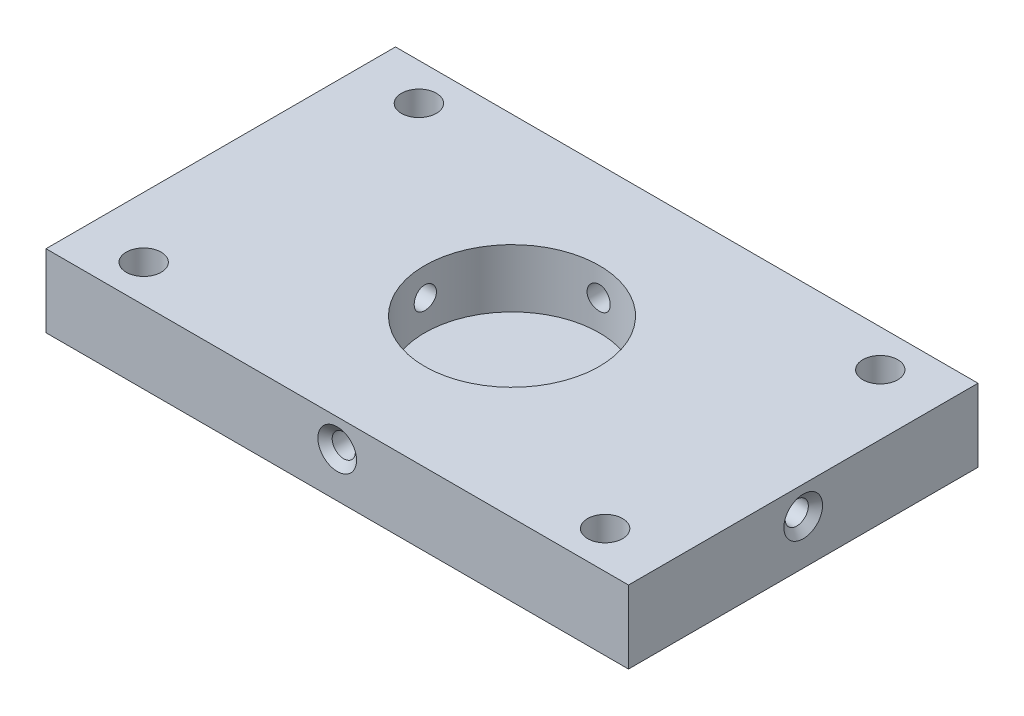
ISO-10303-21;
HEADER;
FILE_DESCRIPTION(('STEP AP214'),'2;1');
FILE_NAME('part.step','',(''),(''),'','','');
FILE_SCHEMA(('AUTOMOTIVE_DESIGN { 1 0 10303 214 1 1 1 1 }'));
ENDSEC;
DATA;
#1=APPLICATION_CONTEXT('core data for automotive mechanical design processes');
#2=APPLICATION_PROTOCOL_DEFINITION('international standard','automotive_design',2000,#1);
#3=PRODUCT_CONTEXT('',#1,'mechanical');
#4=PRODUCT('Part','Part','',(#3));
#5=PRODUCT_RELATED_PRODUCT_CATEGORY('part','',(#4));
#6=PRODUCT_DEFINITION_FORMATION('','',#4);
#7=PRODUCT_DEFINITION_CONTEXT('part definition',#1,'design');
#8=PRODUCT_DEFINITION('design','',#6,#7);
#9=PRODUCT_DEFINITION_SHAPE('','',#8);
#10=(LENGTH_UNIT() NAMED_UNIT(*) SI_UNIT(.MILLI.,.METRE.));
#11=(NAMED_UNIT(*) PLANE_ANGLE_UNIT() SI_UNIT($,.RADIAN.));
#12=(NAMED_UNIT(*) SI_UNIT($,.STERADIAN.) SOLID_ANGLE_UNIT());
#13=UNCERTAINTY_MEASURE_WITH_UNIT(LENGTH_MEASURE(1.E-05),#10,'distance_accuracy_value','');
#14=(GEOMETRIC_REPRESENTATION_CONTEXT(3) GLOBAL_UNCERTAINTY_ASSIGNED_CONTEXT((#13)) GLOBAL_UNIT_ASSIGNED_CONTEXT((#10,
#11,#12)) REPRESENTATION_CONTEXT('',''));
#15=CARTESIAN_POINT('',(0.,0.,0.));
#16=DIRECTION('',(0.,0.,1.));
#17=DIRECTION('',(1.,0.,0.));
#18=AXIS2_PLACEMENT_3D('',#15,#16,#17);
#19=CARTESIAN_POINT('',(-63.5,15.875,-38.1));
#20=DIRECTION('',(0.,0.,1.));
#21=DIRECTION('',(1.,0.,0.));
#22=AXIS2_PLACEMENT_3D('',#19,#20,#21);
#23=PLANE('',#22);
#24=DIRECTION('',(-1.,0.,0.));
#25=VECTOR('',#24,1.);
#26=CARTESIAN_POINT('',(-63.5,0.,-38.1));
#27=LINE('',#26,#25);
#28=CARTESIAN_POINT('',(63.5,0.,-38.1));
#29=VERTEX_POINT('',#28);
#30=CARTESIAN_POINT('',(-63.5,0.,-38.1));
#31=VERTEX_POINT('',#30);
#32=EDGE_CURVE('E89',#29,#31,#27,.T.);
#33=ORIENTED_EDGE('',*,*,#32,.T.);
#34=DIRECTION('',(0.,-1.,0.));
#35=VECTOR('',#34,1.);
#36=CARTESIAN_POINT('',(-63.5,15.875,-38.1));
#37=LINE('',#36,#35);
#38=CARTESIAN_POINT('',(-63.5,15.875,-38.1));
#39=VERTEX_POINT('',#38);
#40=EDGE_CURVE('E42',#39,#31,#37,.T.);
#41=ORIENTED_EDGE('',*,*,#40,.F.);
#42=DIRECTION('',(-1.,0.,0.));
#43=VECTOR('',#42,1.);
#44=CARTESIAN_POINT('',(-63.5,15.875,-38.1));
#45=LINE('',#44,#43);
#46=CARTESIAN_POINT('',(63.5,15.875,-38.1));
#47=VERTEX_POINT('',#46);
#48=EDGE_CURVE('E80',#47,#39,#45,.T.);
#49=ORIENTED_EDGE('',*,*,#48,.F.);
#50=DIRECTION('',(0.,-1.,0.));
#51=VECTOR('',#50,1.);
#52=CARTESIAN_POINT('',(63.5,15.875,-38.1));
#53=LINE('',#52,#51);
#54=EDGE_CURVE('E11',#47,#29,#53,.T.);
#55=ORIENTED_EDGE('',*,*,#54,.T.);
#56=EDGE_LOOP('',(#33,#41,#49,#55));
#57=FACE_BOUND('',#56,.T.);
#58=CARTESIAN_POINT('',(0.,9.779,-38.1));
#59=DIRECTION('',(0.,0.,-1.));
#60=DIRECTION('',(-1.,0.,0.));
#61=AXIS2_PLACEMENT_3D('',#58,#59,#60);
#62=CIRCLE('',#61,4.2164);
#63=CARTESIAN_POINT('',(-4.2164,9.779,-38.1));
#64=VERTEX_POINT('',#63);
#65=EDGE_CURVE('E150',#64,#64,#62,.T.);
#66=ORIENTED_EDGE('',*,*,#65,.F.);
#67=EDGE_LOOP('',(#66));
#68=FACE_BOUND('',#67,.T.);
#69=ADVANCED_FACE('F33',(#57,#68),#23,.F.);
#70=CARTESIAN_POINT('',(63.5,15.875,38.1));
#71=DIRECTION('',(-1.,0.,0.));
#72=DIRECTION('',(0.,0.,1.));
#73=AXIS2_PLACEMENT_3D('',#70,#71,#72);
#74=PLANE('',#73);
#75=CARTESIAN_POINT('',(63.5,9.779,0.));
#76=DIRECTION('',(1.,0.,0.));
#77=DIRECTION('',(0.,0.,-1.));
#78=AXIS2_PLACEMENT_3D('',#75,#76,#77);
#79=CIRCLE('',#78,4.2164);
#80=CARTESIAN_POINT('',(63.5,9.779,-4.2164));
#81=VERTEX_POINT('',#80);
#82=EDGE_CURVE('E243',#81,#81,#79,.T.);
#83=ORIENTED_EDGE('',*,*,#82,.F.);
#84=EDGE_LOOP('',(#83));
#85=FACE_BOUND('',#84,.T.);
#86=DIRECTION('',(0.,0.,-1.));
#87=VECTOR('',#86,1.);
#88=CARTESIAN_POINT('',(63.5,0.,38.1));
#89=LINE('',#88,#87);
#90=CARTESIAN_POINT('',(63.5,0.,38.1));
#91=VERTEX_POINT('',#90);
#92=EDGE_CURVE('E97',#91,#29,#89,.T.);
#93=ORIENTED_EDGE('',*,*,#92,.T.);
#94=ORIENTED_EDGE('',*,*,#54,.F.);
#95=DIRECTION('',(0.,0.,-1.));
#96=VECTOR('',#95,1.);
#97=CARTESIAN_POINT('',(63.5,15.875,38.1));
#98=LINE('',#97,#96);
#99=CARTESIAN_POINT('',(63.5,15.875,38.1));
#100=VERTEX_POINT('',#99);
#101=EDGE_CURVE('E85',#100,#47,#98,.T.);
#102=ORIENTED_EDGE('',*,*,#101,.F.);
#103=DIRECTION('',(0.,-1.,0.));
#104=VECTOR('',#103,1.);
#105=CARTESIAN_POINT('',(63.5,15.875,38.1));
#106=LINE('',#105,#104);
#107=EDGE_CURVE('E93',#100,#91,#106,.T.);
#108=ORIENTED_EDGE('',*,*,#107,.T.);
#109=EDGE_LOOP('',(#93,#94,#102,#108));
#110=FACE_BOUND('',#109,.T.);
#111=ADVANCED_FACE('F35',(#85,#110),#74,.F.);
#112=CARTESIAN_POINT('',(-63.5,15.875,38.1));
#113=DIRECTION('',(1.,0.,0.));
#114=DIRECTION('',(0.,0.,-1.));
#115=AXIS2_PLACEMENT_3D('',#112,#113,#114);
#116=PLANE('',#115);
#117=CARTESIAN_POINT('',(-63.5,9.779,0.));
#118=DIRECTION('',(-1.,0.,0.));
#119=DIRECTION('',(0.,0.,1.));
#120=AXIS2_PLACEMENT_3D('',#117,#118,#119);
#121=CIRCLE('',#120,3.0607);
#122=CARTESIAN_POINT('',(-63.5,9.779,3.0607));
#123=VERTEX_POINT('',#122);
#124=EDGE_CURVE('E197',#123,#123,#121,.T.);
#125=ORIENTED_EDGE('',*,*,#124,.F.);
#126=EDGE_LOOP('',(#125));
#127=FACE_BOUND('',#126,.T.);
#128=DIRECTION('',(0.,0.,1.));
#129=VECTOR('',#128,1.);
#130=CARTESIAN_POINT('',(-63.5,0.,38.1));
#131=LINE('',#130,#129);
#132=CARTESIAN_POINT('',(-63.5,0.,38.1));
#133=VERTEX_POINT('',#132);
#134=EDGE_CURVE('E67',#31,#133,#131,.T.);
#135=ORIENTED_EDGE('',*,*,#134,.T.);
#136=DIRECTION('',(0.,-1.,0.));
#137=VECTOR('',#136,1.);
#138=CARTESIAN_POINT('',(-63.5,15.875,38.1));
#139=LINE('',#138,#137);
#140=CARTESIAN_POINT('',(-63.5,15.875,38.1));
#141=VERTEX_POINT('',#140);
#142=EDGE_CURVE('E90',#141,#133,#139,.T.);
#143=ORIENTED_EDGE('',*,*,#142,.F.);
#144=DIRECTION('',(0.,0.,1.));
#145=VECTOR('',#144,1.);
#146=CARTESIAN_POINT('',(-63.5,15.875,38.1));
#147=LINE('',#146,#145);
#148=EDGE_CURVE('E83',#39,#141,#147,.T.);
#149=ORIENTED_EDGE('',*,*,#148,.F.);
#150=ORIENTED_EDGE('',*,*,#40,.T.);
#151=EDGE_LOOP('',(#135,#143,#149,#150));
#152=FACE_BOUND('',#151,.T.);
#153=ADVANCED_FACE('F91',(#127,#152),#116,.F.);
#154=CARTESIAN_POINT('',(-63.5,15.875,38.1));
#155=DIRECTION('',(0.,0.,-1.));
#156=DIRECTION('',(-1.,0.,0.));
#157=AXIS2_PLACEMENT_3D('',#154,#155,#156);
#158=PLANE('',#157);
#159=CARTESIAN_POINT('',(0.,9.779,38.1));
#160=DIRECTION('',(0.,0.,1.));
#161=DIRECTION('',(1.,0.,0.));
#162=AXIS2_PLACEMENT_3D('',#159,#160,#161);
#163=CIRCLE('',#162,4.2164);
#164=CARTESIAN_POINT('',(4.2164,9.779,38.1));
#165=VERTEX_POINT('',#164);
#166=EDGE_CURVE('E211',#165,#165,#163,.T.);
#167=ORIENTED_EDGE('',*,*,#166,.F.);
#168=EDGE_LOOP('',(#167));
#169=FACE_BOUND('',#168,.T.);
#170=DIRECTION('',(1.,0.,0.));
#171=VECTOR('',#170,1.);
#172=CARTESIAN_POINT('',(-63.5,0.,38.1));
#173=LINE('',#172,#171);
#174=EDGE_CURVE('E73',#133,#91,#173,.T.);
#175=ORIENTED_EDGE('',*,*,#174,.T.);
#176=ORIENTED_EDGE('',*,*,#107,.F.);
#177=DIRECTION('',(1.,0.,0.));
#178=VECTOR('',#177,1.);
#179=CARTESIAN_POINT('',(-63.5,15.875,38.1));
#180=LINE('',#179,#178);
#181=EDGE_CURVE('E50',#141,#100,#180,.T.);
#182=ORIENTED_EDGE('',*,*,#181,.F.);
#183=ORIENTED_EDGE('',*,*,#142,.T.);
#184=EDGE_LOOP('',(#175,#176,#182,#183));
#185=FACE_BOUND('',#184,.T.);
#186=ADVANCED_FACE('F105',(#169,#185),#158,.F.);
#187=CARTESIAN_POINT('',(0.,15.875,0.));
#188=DIRECTION('',(0.,-1.,0.));
#189=DIRECTION('',(0.,0.,-1.));
#190=AXIS2_PLACEMENT_3D('',#187,#188,#189);
#191=PLANE('',#190);
#192=CARTESIAN_POINT('',(50.2999999999988,15.875,-29.9999999999997));
#193=DIRECTION('',(0.,-1.,0.));
#194=DIRECTION('',(0.,0.,-1.));
#195=AXIS2_PLACEMENT_3D('',#192,#193,#194);
#196=CIRCLE('',#195,3.81);
#197=CARTESIAN_POINT('',(50.2999999999988,15.875,-33.8099999999997));
#198=VERTEX_POINT('',#197);
#199=EDGE_CURVE('E289',#198,#198,#196,.T.);
#200=ORIENTED_EDGE('',*,*,#199,.T.);
#201=EDGE_LOOP('',(#200));
#202=FACE_BOUND('',#201,.T.);
#203=CARTESIAN_POINT('',(50.2999999999988,15.875,30.0000000000003));
#204=DIRECTION('',(0.,-1.,0.));
#205=DIRECTION('',(0.,0.,-1.));
#206=AXIS2_PLACEMENT_3D('',#203,#204,#205);
#207=CIRCLE('',#206,3.81);
#208=CARTESIAN_POINT('',(50.2999999999988,15.875,26.1900000000003));
#209=VERTEX_POINT('',#208);
#210=EDGE_CURVE('E279',#209,#209,#207,.T.);
#211=ORIENTED_EDGE('',*,*,#210,.T.);
#212=EDGE_LOOP('',(#211));
#213=FACE_BOUND('',#212,.T.);
#214=CARTESIAN_POINT('',(-50.3000000000012,15.875,30.0000000000003));
#215=DIRECTION('',(0.,-1.,0.));
#216=DIRECTION('',(0.,0.,-1.));
#217=AXIS2_PLACEMENT_3D('',#214,#215,#216);
#218=CIRCLE('',#217,3.81);
#219=CARTESIAN_POINT('',(-50.3000000000012,15.875,26.1900000000003));
#220=VERTEX_POINT('',#219);
#221=EDGE_CURVE('E274',#220,#220,#218,.T.);
#222=ORIENTED_EDGE('',*,*,#221,.T.);
#223=EDGE_LOOP('',(#222));
#224=FACE_BOUND('',#223,.T.);
#225=CARTESIAN_POINT('',(-50.3000000000012,15.875,-29.9999999999997));
#226=DIRECTION('',(0.,-1.,0.));
#227=DIRECTION('',(0.,0.,-1.));
#228=AXIS2_PLACEMENT_3D('',#225,#226,#227);
#229=CIRCLE('',#228,3.81);
#230=CARTESIAN_POINT('',(-50.3000000000012,15.875,-33.8099999999997));
#231=VERTEX_POINT('',#230);
#232=EDGE_CURVE('E295',#231,#231,#229,.T.);
#233=ORIENTED_EDGE('',*,*,#232,.T.);
#234=EDGE_LOOP('',(#233));
#235=FACE_BOUND('',#234,.T.);
#236=CARTESIAN_POINT('',(0.,15.875,0.));
#237=DIRECTION('',(0.,1.,0.));
#238=DIRECTION('',(0.,0.,1.));
#239=AXIS2_PLACEMENT_3D('',#236,#237,#238);
#240=CIRCLE('',#239,19.05);
#241=CARTESIAN_POINT('',(0.,15.875,19.05));
#242=VERTEX_POINT('',#241);
#243=EDGE_CURVE('E111',#242,#242,#240,.T.);
#244=ORIENTED_EDGE('',*,*,#243,.F.);
#245=EDGE_LOOP('',(#244));
#246=FACE_BOUND('',#245,.T.);
#247=ORIENTED_EDGE('',*,*,#101,.T.);
#248=ORIENTED_EDGE('',*,*,#48,.T.);
#249=ORIENTED_EDGE('',*,*,#148,.T.);
#250=ORIENTED_EDGE('',*,*,#181,.T.);
#251=EDGE_LOOP('',(#247,#248,#249,#250));
#252=FACE_BOUND('',#251,.T.);
#253=ADVANCED_FACE('F81',(#202,#213,#224,#235,#246,#252),#191,.F.);
#254=CARTESIAN_POINT('',(0.,0.,0.));
#255=DIRECTION('',(0.,-1.,0.));
#256=DIRECTION('',(0.,0.,-1.));
#257=AXIS2_PLACEMENT_3D('',#254,#255,#256);
#258=PLANE('',#257);
#259=CARTESIAN_POINT('',(50.2999999999988,0.,-29.9999999999997));
#260=DIRECTION('',(0.,-1.,0.));
#261=DIRECTION('',(0.,0.,-1.));
#262=AXIS2_PLACEMENT_3D('',#259,#260,#261);
#263=CIRCLE('',#262,3.81);
#264=CARTESIAN_POINT('',(50.2999999999988,0.,-33.8099999999997));
#265=VERTEX_POINT('',#264);
#266=EDGE_CURVE('E292',#265,#265,#263,.T.);
#267=ORIENTED_EDGE('',*,*,#266,.F.);
#268=EDGE_LOOP('',(#267));
#269=FACE_BOUND('',#268,.T.);
#270=CARTESIAN_POINT('',(50.2999999999988,0.,30.0000000000003));
#271=DIRECTION('',(0.,-1.,0.));
#272=DIRECTION('',(0.,0.,-1.));
#273=AXIS2_PLACEMENT_3D('',#270,#271,#272);
#274=CIRCLE('',#273,3.81);
#275=CARTESIAN_POINT('',(50.2999999999988,0.,26.1900000000003));
#276=VERTEX_POINT('',#275);
#277=EDGE_CURVE('E284',#276,#276,#274,.T.);
#278=ORIENTED_EDGE('',*,*,#277,.F.);
#279=EDGE_LOOP('',(#278));
#280=FACE_BOUND('',#279,.T.);
#281=CARTESIAN_POINT('',(-50.3000000000012,0.,30.0000000000003));
#282=DIRECTION('',(0.,-1.,0.));
#283=DIRECTION('',(0.,0.,-1.));
#284=AXIS2_PLACEMENT_3D('',#281,#282,#283);
#285=CIRCLE('',#284,3.81);
#286=CARTESIAN_POINT('',(-50.3000000000012,0.,26.1900000000003));
#287=VERTEX_POINT('',#286);
#288=EDGE_CURVE('E277',#287,#287,#285,.T.);
#289=ORIENTED_EDGE('',*,*,#288,.F.);
#290=EDGE_LOOP('',(#289));
#291=FACE_BOUND('',#290,.T.);
#292=CARTESIAN_POINT('',(-50.3000000000012,0.,-29.9999999999997));
#293=DIRECTION('',(0.,-1.,0.));
#294=DIRECTION('',(0.,0.,-1.));
#295=AXIS2_PLACEMENT_3D('',#292,#293,#294);
#296=CIRCLE('',#295,3.81);
#297=CARTESIAN_POINT('',(-50.3000000000012,0.,-33.8099999999997));
#298=VERTEX_POINT('',#297);
#299=EDGE_CURVE('E281',#298,#298,#296,.T.);
#300=ORIENTED_EDGE('',*,*,#299,.F.);
#301=EDGE_LOOP('',(#300));
#302=FACE_BOUND('',#301,.T.);
#303=ORIENTED_EDGE('',*,*,#92,.F.);
#304=ORIENTED_EDGE('',*,*,#174,.F.);
#305=ORIENTED_EDGE('',*,*,#134,.F.);
#306=ORIENTED_EDGE('',*,*,#32,.F.);
#307=EDGE_LOOP('',(#303,#304,#305,#306));
#308=FACE_BOUND('',#307,.T.);
#309=ADVANCED_FACE('F108',(#269,#280,#291,#302,#308),#258,.T.);
#310=CARTESIAN_POINT('',(0.,3.175,0.));
#311=DIRECTION('',(0.,1.,0.));
#312=DIRECTION('',(0.,0.,1.));
#313=AXIS2_PLACEMENT_3D('',#310,#311,#312);
#314=CYLINDRICAL_SURFACE('',#313,19.05);
#315=CARTESIAN_POINT('',(18.8816115496003,9.779,-2.52729999999999));
#316=CARTESIAN_POINT('',(18.8816136860139,9.63771227229648,-2.52729403857509));
#317=CARTESIAN_POINT('',(18.8832145290153,9.49633804309624,-2.51541204226718));
#318=CARTESIAN_POINT('',(18.8894419663185,9.21752927661682,-2.46820323583721));
#319=CARTESIAN_POINT('',(18.8940716617758,9.08009892807163,-2.43285239608769));
#320=CARTESIAN_POINT('',(18.9058233966564,8.81325468639615,-2.33977094861171));
#321=CARTESIAN_POINT('',(18.9129436806646,8.68383522245737,-2.28205610039176));
#322=CARTESIAN_POINT('',(18.9288722131768,8.43654066937657,-2.14591972004341));
#323=CARTESIAN_POINT('',(18.9376801892989,8.3186637219839,-2.06750152852222));
#324=CARTESIAN_POINT('',(18.9560536634576,8.09703662891582,-1.89165680234037));
#325=CARTESIAN_POINT('',(18.9656231397511,7.99336957965968,-1.79412594019999));
#326=CARTESIAN_POINT('',(18.9844056832389,7.80382348385273,-1.58304926203418));
#327=CARTESIAN_POINT('',(18.99361873216,7.71794534831505,-1.46950262630271));
#328=CARTESIAN_POINT('',(19.0106913739933,7.56611407673407,-1.22909208014261));
#329=CARTESIAN_POINT('',(19.0185457830168,7.50023656156916,-1.10218001188377));
#330=CARTESIAN_POINT('',(19.0319723350527,7.39076116632366,-0.838971953400609));
#331=CARTESIAN_POINT('',(19.0375445730402,7.34716235907,-0.702676353958657));
#332=CARTESIAN_POINT('',(19.0457509081025,7.28373141214528,-0.425422080123692));
#333=CARTESIAN_POINT('',(19.0484021207693,7.26376077298878,-0.284495606725753));
#334=CARTESIAN_POINT('',(19.050526196553,7.24772358866896,-0.00126840800494828));
#335=CARTESIAN_POINT('',(19.0499991995944,7.25165599114651,0.141032256542166));
#336=CARTESIAN_POINT('',(19.0458400320926,7.28320275827129,0.422025386288018));
#337=CARTESIAN_POINT('',(19.0422273944274,7.31066815661473,0.560734905656261));
#338=CARTESIAN_POINT('',(19.0323247237867,7.38826813112801,0.831558526160853));
#339=CARTESIAN_POINT('',(19.0260346345507,7.43840318364992,0.963672488641553));
#340=CARTESIAN_POINT('',(19.0114501507867,7.56007602096922,1.21801297470227));
#341=CARTESIAN_POINT('',(19.0031497810637,7.63167776544477,1.34020854433632));
#342=CARTESIAN_POINT('',(18.9854723641041,7.79420490334275,1.57090593663465));
#343=CARTESIAN_POINT('',(18.976095261292,7.88513129441078,1.67940705185402));
#344=CARTESIAN_POINT('',(18.9572275556861,8.08455972856381,1.88051162780054));
#345=CARTESIAN_POINT('',(18.9477366348273,8.19319166944412,1.97298629101879));
#346=CARTESIAN_POINT('',(18.929781972601,8.4245027343027,2.13841057144089));
#347=CARTESIAN_POINT('',(18.9213182352323,8.54718191296373,2.2113601126341));
#348=CARTESIAN_POINT('',(18.9063764389157,8.80322539298912,2.33567360849175));
#349=CARTESIAN_POINT('',(18.8998994065849,8.93659517390743,2.38702640824808));
#350=CARTESIAN_POINT('',(18.8896838276971,9.21017056287522,2.46657009482038));
#351=CARTESIAN_POINT('',(18.8859451318228,9.35037579775303,2.49476224456168));
#352=CARTESIAN_POINT('',(18.8816571603547,9.63250223902257,2.52701204822479));
#353=CARTESIAN_POINT('',(18.8810838818636,9.77440233125266,2.53125133891124));
#354=CARTESIAN_POINT('',(18.8831281050051,10.0568889159055,2.51595512152457));
#355=CARTESIAN_POINT('',(18.8857455297861,10.1974754398848,2.49642018607891));
#356=CARTESIAN_POINT('',(18.8938542988731,10.4727945557492,2.4342833029449));
#357=CARTESIAN_POINT('',(18.8993345916887,10.6075475158213,2.39177003647419));
#358=CARTESIAN_POINT('',(18.9125426072633,10.86801302946,2.28497484809433));
#359=CARTESIAN_POINT('',(18.920270418359,10.9937252274444,2.22069207053557));
#360=CARTESIAN_POINT('',(18.9371599720443,11.2333603229345,2.07173896352522));
#361=CARTESIAN_POINT('',(18.9463299484798,11.3472088656839,1.98694996159107));
#362=CARTESIAN_POINT('',(18.9650450716013,11.5591246098108,1.7995582051803));
#363=CARTESIAN_POINT('',(18.9745902347538,11.6571911175688,1.69695466816763));
#364=CARTESIAN_POINT('',(18.9930543455039,11.8354012046235,1.47605104074714));
#365=CARTESIAN_POINT('',(19.001968858176,11.9154251336789,1.35765400044801));
#366=CARTESIAN_POINT('',(19.0181002066806,12.0544489407973,1.10899317963866));
#367=CARTESIAN_POINT('',(19.0253170803776,12.1134492877917,0.978729663891901));
#368=CARTESIAN_POINT('',(19.0372203988511,12.2085553775692,0.710424235553415));
#369=CARTESIAN_POINT('',(19.0419143608394,12.2447291904796,0.572406799126668));
#370=CARTESIAN_POINT('',(19.0482742919279,12.2933765073272,0.292190447518112));
#371=CARTESIAN_POINT('',(19.049940415735,12.3058512221671,0.149991746354576));
#372=CARTESIAN_POINT('',(19.0500559798988,12.3067216118732,-0.133384639284181));
#373=CARTESIAN_POINT('',(19.0485300109331,12.2953013643513,-0.274561783476493));
#374=CARTESIAN_POINT('',(19.042481917783,12.2490972270943,-0.552970842606765));
#375=CARTESIAN_POINT('',(19.0379597976124,12.2143133686581,-0.690202762829653));
#376=CARTESIAN_POINT('',(19.0264251507238,12.1224294229477,-0.9567940478224));
#377=CARTESIAN_POINT('',(19.0194137363265,12.0653393019012,-1.086156898629));
#378=CARTESIAN_POINT('',(19.0036750614689,11.9304825597987,-1.33349561441541));
#379=CARTESIAN_POINT('',(18.9949477702481,11.8527155680601,-1.45147127520074));
#380=CARTESIAN_POINT('',(18.9766702054357,11.6780357396476,-1.67362540916794));
#381=CARTESIAN_POINT('',(18.9671143464667,11.5809861767308,-1.77769592240906));
#382=CARTESIAN_POINT('',(18.948300471299,11.3707819281971,-1.96814433179259));
#383=CARTESIAN_POINT('',(18.9390425259448,11.2576234460433,-2.05451804542919));
#384=CARTESIAN_POINT('',(18.9218297080201,11.0178436900185,-2.20744792827494));
#385=CARTESIAN_POINT('',(18.9138806796516,10.8911659883658,-2.27391624706802));
#386=CARTESIAN_POINT('',(18.900254131466,10.6284080753484,-2.38453933627933));
#387=CARTESIAN_POINT('',(18.8945741748827,10.492338135586,-2.42871805707922));
#388=CARTESIAN_POINT('',(18.8874889582376,10.2594912160249,-2.48308811908104));
#389=CARTESIAN_POINT('',(18.8852961072915,10.1641748251294,-2.4996433016576));
#390=CARTESIAN_POINT('',(18.8823566787731,9.97225244008656,-2.52175123162282));
#391=CARTESIAN_POINT('',(18.881610088208,9.87564645753227,-2.52730407785308));
#392=CARTESIAN_POINT('',(18.8816115496003,9.779,-2.52729999999999));
#393=B_SPLINE_CURVE_WITH_KNOTS('',3,(#315,#316,#317,#318,#319,#320,#321,#322,#323,#324,#325,
#326,#327,#328,#329,#330,#331,#332,#333,#334,#335,#336,#337,#338,#339,#340,#341,#342,#343,#344,
#345,#346,#347,#348,#349,#350,#351,#352,#353,#354,#355,#356,#357,#358,#359,#360,#361,#362,#363,
#364,#365,#366,#367,#368,#369,#370,#371,#372,#373,#374,#375,#376,#377,#378,#379,#380,#381,#382,
#383,#384,#385,#386,#387,#388,#389,#390,#391,#392),.UNSPECIFIED.,.T.,.F.,(4,2,2,2,2,2,2,2,2,2,2,
2,2,2,2,2,2,2,2,2,2,2,2,2,2,2,2,2,2,2,2,2,2,2,2,2,2,2,4),(0.,0.423510065907904,
0.847454431742954,1.27110059346449,1.69467843909964,2.12063626372645,2.54661589728922,
2.97418662662968,3.40173956030838,3.82677372275566,4.25178917271627,4.6741339407785,
5.09648758388365,5.52011234497463,5.94375898124377,6.37066655210402,6.79757578487661,
7.22470525003706,7.65181142274105,8.07567441760114,8.49952720347359,8.92175575678369,
9.34400090769416,9.76875072103493,10.1935191970112,10.6210267110947,11.0485246890144,
11.4747417411106,11.9009370151089,12.3238611366983,12.7467846917222,13.1695195041705,
13.592261895669,14.0181162683994,14.4440711728099,14.8718791817456,15.2992265227207,
15.5889269516166,15.8786247779214),.UNSPECIFIED.);
#394=CARTESIAN_POINT('',(18.8816115496003,9.779,-2.52729999999999));
#395=VERTEX_POINT('',#394);
#396=EDGE_CURVE('E233',#395,#395,#393,.T.);
#397=ORIENTED_EDGE('',*,*,#396,.F.);
#398=EDGE_LOOP('',(#397));
#399=FACE_BOUND('',#398,.T.);
#400=CARTESIAN_POINT('',(2.52729999999999,9.779,18.8816115496003));
#401=CARTESIAN_POINT('',(2.52729403857509,9.63771227229648,18.8816136860139));
#402=CARTESIAN_POINT('',(2.51541204226718,9.49633804309624,18.8832145290153));
#403=CARTESIAN_POINT('',(2.46820323583721,9.21752927661682,18.8894419663185));
#404=CARTESIAN_POINT('',(2.43285239608769,9.08009892807163,18.8940716617758));
#405=CARTESIAN_POINT('',(2.33977094861172,8.81325468639615,18.9058233966564));
#406=CARTESIAN_POINT('',(2.28205610039177,8.68383522245737,18.9129436806646));
#407=CARTESIAN_POINT('',(2.14591972004342,8.43654066937657,18.9288722131768));
#408=CARTESIAN_POINT('',(2.06750152852222,8.3186637219839,18.9376801892989));
#409=CARTESIAN_POINT('',(1.89165680234037,8.09703662891582,18.9560536634576));
#410=CARTESIAN_POINT('',(1.79412594019999,7.99336957965967,18.9656231397511));
#411=CARTESIAN_POINT('',(1.58304926203418,7.80382348385273,18.9844056832389));
#412=CARTESIAN_POINT('',(1.46950262630271,7.71794534831505,18.99361873216));
#413=CARTESIAN_POINT('',(1.22909208014261,7.56611407673407,19.0106913739933));
#414=CARTESIAN_POINT('',(1.10218001188377,7.50023656156916,19.0185457830168));
#415=CARTESIAN_POINT('',(0.83897195340061,7.39076116632365,19.0319723350527));
#416=CARTESIAN_POINT('',(0.702676353958658,7.34716235907,19.0375445730402));
#417=CARTESIAN_POINT('',(0.425422080123692,7.28373141214528,19.0457509081025));
#418=CARTESIAN_POINT('',(0.284495606725753,7.26376077298877,19.0484021207693));
#419=CARTESIAN_POINT('',(0.0012684080049475,7.24772358866896,19.050526196553));
#420=CARTESIAN_POINT('',(-0.141032256542167,7.25165599114651,19.0499991995944));
#421=CARTESIAN_POINT('',(-0.42202538628802,7.28320275827129,19.0458400320926));
#422=CARTESIAN_POINT('',(-0.560734905656262,7.31066815661472,19.0422273944274));
#423=CARTESIAN_POINT('',(-0.831558526160855,7.38826813112801,19.0323247237867));
#424=CARTESIAN_POINT('',(-0.963672488641555,7.43840318364992,19.0260346345507));
#425=CARTESIAN_POINT('',(-1.21801297470228,7.56007602096922,19.0114501507867));
#426=CARTESIAN_POINT('',(-1.34020854433632,7.63167776544477,19.0031497810637));
#427=CARTESIAN_POINT('',(-1.57090593663465,7.79420490334275,18.9854723641041));
#428=CARTESIAN_POINT('',(-1.67940705185402,7.88513129441078,18.976095261292));
#429=CARTESIAN_POINT('',(-1.88051162780054,8.08455972856381,18.9572275556861));
#430=CARTESIAN_POINT('',(-1.97298629101879,8.19319166944412,18.9477366348273));
#431=CARTESIAN_POINT('',(-2.13841057144089,8.4245027343027,18.929781972601));
#432=CARTESIAN_POINT('',(-2.21136011263411,8.54718191296373,18.9213182352323));
#433=CARTESIAN_POINT('',(-2.33567360849175,8.80322539298912,18.9063764389157));
#434=CARTESIAN_POINT('',(-2.38702640824808,8.93659517390743,18.8998994065849));
#435=CARTESIAN_POINT('',(-2.46657009482038,9.21017056287522,18.8896838276971));
#436=CARTESIAN_POINT('',(-2.49476224456168,9.35037579775303,18.8859451318228));
#437=CARTESIAN_POINT('',(-2.52701204822479,9.63250223902257,18.8816571603547));
#438=CARTESIAN_POINT('',(-2.53125133891124,9.77440233125266,18.8810838818636));
#439=CARTESIAN_POINT('',(-2.51595512152457,10.0568889159055,18.8831281050051));
#440=CARTESIAN_POINT('',(-2.49642018607891,10.1974754398848,18.8857455297861));
#441=CARTESIAN_POINT('',(-2.43428330294491,10.4727945557492,18.8938542988731));
#442=CARTESIAN_POINT('',(-2.39177003647419,10.6075475158213,18.8993345916887));
#443=CARTESIAN_POINT('',(-2.28497484809434,10.86801302946,18.9125426072633));
#444=CARTESIAN_POINT('',(-2.22069207053557,10.9937252274444,18.920270418359));
#445=CARTESIAN_POINT('',(-2.07173896352522,11.2333603229345,18.9371599720443));
#446=CARTESIAN_POINT('',(-1.98694996159107,11.3472088656839,18.9463299484798));
#447=CARTESIAN_POINT('',(-1.79955820518031,11.5591246098108,18.9650450716013));
#448=CARTESIAN_POINT('',(-1.69695466816763,11.6571911175688,18.9745902347538));
#449=CARTESIAN_POINT('',(-1.47605104074714,11.8354012046235,18.9930543455039));
#450=CARTESIAN_POINT('',(-1.35765400044801,11.9154251336789,19.001968858176));
#451=CARTESIAN_POINT('',(-1.10899317963866,12.0544489407973,19.0181002066806));
#452=CARTESIAN_POINT('',(-0.978729663891902,12.1134492877917,19.0253170803776));
#453=CARTESIAN_POINT('',(-0.710424235553416,12.2085553775693,19.0372203988511));
#454=CARTESIAN_POINT('',(-0.572406799126668,12.2447291904796,19.0419143608394));
#455=CARTESIAN_POINT('',(-0.292190447518112,12.2933765073272,19.0482742919279));
#456=CARTESIAN_POINT('',(-0.149991746354575,12.3058512221671,19.049940415735));
#457=CARTESIAN_POINT('',(0.133384639284182,12.3067216118732,19.0500559798988));
#458=CARTESIAN_POINT('',(0.274561783476494,12.2953013643513,19.0485300109331));
#459=CARTESIAN_POINT('',(0.552970842606766,12.2490972270943,19.042481917783));
#460=CARTESIAN_POINT('',(0.690202762829655,12.2143133686581,19.0379597976124));
#461=CARTESIAN_POINT('',(0.956794047822402,12.1224294229477,19.0264251507238));
#462=CARTESIAN_POINT('',(1.086156898629,12.0653393019012,19.0194137363265));
#463=CARTESIAN_POINT('',(1.33349561441541,11.9304825597987,19.0036750614689));
#464=CARTESIAN_POINT('',(1.45147127520074,11.8527155680601,18.9949477702481));
#465=CARTESIAN_POINT('',(1.67362540916794,11.6780357396476,18.9766702054357));
#466=CARTESIAN_POINT('',(1.77769592240906,11.5809861767308,18.9671143464667));
#467=CARTESIAN_POINT('',(1.96814433179259,11.3707819281971,18.948300471299));
#468=CARTESIAN_POINT('',(2.05451804542919,11.2576234460433,18.9390425259448));
#469=CARTESIAN_POINT('',(2.20744792827494,11.0178436900185,18.9218297080201));
#470=CARTESIAN_POINT('',(2.27391624706802,10.8911659883658,18.9138806796516));
#471=CARTESIAN_POINT('',(2.38453933627933,10.6284080753484,18.900254131466));
#472=CARTESIAN_POINT('',(2.42871805707922,10.492338135586,18.8945741748827));
#473=CARTESIAN_POINT('',(2.48308811908105,10.2594912160249,18.8874889582376));
#474=CARTESIAN_POINT('',(2.4996433016576,10.1641748251294,18.8852961072915));
#475=CARTESIAN_POINT('',(2.52175123162282,9.97225244008656,18.8823566787731));
#476=CARTESIAN_POINT('',(2.52730407785309,9.87564645753227,18.881610088208));
#477=CARTESIAN_POINT('',(2.52729999999999,9.779,18.8816115496003));
#478=B_SPLINE_CURVE_WITH_KNOTS('',3,(#400,#401,#402,#403,#404,#405,#406,#407,#408,#409,#410,
#411,#412,#413,#414,#415,#416,#417,#418,#419,#420,#421,#422,#423,#424,#425,#426,#427,#428,#429,
#430,#431,#432,#433,#434,#435,#436,#437,#438,#439,#440,#441,#442,#443,#444,#445,#446,#447,#448,
#449,#450,#451,#452,#453,#454,#455,#456,#457,#458,#459,#460,#461,#462,#463,#464,#465,#466,#467,
#468,#469,#470,#471,#472,#473,#474,#475,#476,#477),.UNSPECIFIED.,.T.,.F.,(4,2,2,2,2,2,2,2,2,2,2,
2,2,2,2,2,2,2,2,2,2,2,2,2,2,2,2,2,2,2,2,2,2,2,2,2,2,2,4),(0.,0.423510065907906,
0.847454431742956,1.27110059346449,1.69467843909965,2.12063626372646,2.54661589728922,
2.97418662662968,3.40173956030838,3.82677372275567,4.25178917271627,4.67413394077851,
5.09648758388365,5.52011234497464,5.94375898124378,6.37066655210404,6.79757578487662,
7.22470525003707,7.65181142274107,8.07567441760115,8.4995272034736,8.92175575678371,
9.34400090769418,9.76875072103495,10.1935191970113,10.6210267110947,11.0485246890144,
11.4747417411107,11.9009370151089,12.3238611366984,12.7467846917222,13.1695195041705,
13.5922618956691,14.0181162683994,14.4440711728099,14.8718791817456,15.2992265227207,
15.5889269516166,15.8786247779215),.UNSPECIFIED.);
#479=CARTESIAN_POINT('',(2.52729999999999,9.779,18.8816115496003));
#480=VERTEX_POINT('',#479);
#481=EDGE_CURVE('E199',#480,#480,#478,.T.);
#482=ORIENTED_EDGE('',*,*,#481,.F.);
#483=EDGE_LOOP('',(#482));
#484=FACE_BOUND('',#483,.T.);
#485=CARTESIAN_POINT('',(-2.52729999999999,9.779,-18.8816115496003));
#486=CARTESIAN_POINT('',(-2.5272940385751,9.92028772770352,-18.8816136860139));
#487=CARTESIAN_POINT('',(-2.51541204226719,10.0616619569038,-18.8832145290153));
#488=CARTESIAN_POINT('',(-2.46820323583722,10.3404707233832,-18.8894419663185));
#489=CARTESIAN_POINT('',(-2.4328523960877,10.4779010719284,-18.8940716617758));
#490=CARTESIAN_POINT('',(-2.33977094861172,10.7447453136038,-18.9058233966564));
#491=CARTESIAN_POINT('',(-2.28205610039177,10.8741647775426,-18.9129436806646));
#492=CARTESIAN_POINT('',(-2.14591972004342,11.1214593306234,-18.9288722131768));
#493=CARTESIAN_POINT('',(-2.06750152852223,11.2393362780161,-18.9376801892989));
#494=CARTESIAN_POINT('',(-1.89165680234037,11.4609633710842,-18.9560536634576));
#495=CARTESIAN_POINT('',(-1.7941259402,11.5646304203403,-18.9656231397511));
#496=CARTESIAN_POINT('',(-1.58304926203418,11.7541765161473,-18.9844056832389));
#497=CARTESIAN_POINT('',(-1.46950262630271,11.840054651685,-18.99361873216));
#498=CARTESIAN_POINT('',(-1.22909208014261,11.9918859232659,-19.0106913739933));
#499=CARTESIAN_POINT('',(-1.10218001188377,12.0577634384308,-19.0185457830168));
#500=CARTESIAN_POINT('',(-0.838971953400611,12.1672388336764,-19.0319723350527));
#501=CARTESIAN_POINT('',(-0.702676353958659,12.21083764093,-19.0375445730402));
#502=CARTESIAN_POINT('',(-0.425422080123692,12.2742685878547,-19.0457509081025));
#503=CARTESIAN_POINT('',(-0.284495606725753,12.2942392270112,-19.0484021207693));
#504=CARTESIAN_POINT('',(-0.00126840800494671,12.310276411331,-19.050526196553));
#505=CARTESIAN_POINT('',(0.141032256542168,12.3063440088535,-19.0499991995944));
#506=CARTESIAN_POINT('',(0.422025386288021,12.2747972417287,-19.0458400320926));
#507=CARTESIAN_POINT('',(0.560734905656264,12.2473318433853,-19.0422273944274));
#508=CARTESIAN_POINT('',(0.831558526160858,12.169731868872,-19.0323247237867));
#509=CARTESIAN_POINT('',(0.963672488641558,12.1195968163501,-19.0260346345507));
#510=CARTESIAN_POINT('',(1.21801297470228,11.9979239790308,-19.0114501507867));
#511=CARTESIAN_POINT('',(1.34020854433632,11.9263222345552,-19.0031497810637));
#512=CARTESIAN_POINT('',(1.57090593663466,11.7637950966573,-18.9854723641041));
#513=CARTESIAN_POINT('',(1.67940705185403,11.6728687055892,-18.976095261292));
#514=CARTESIAN_POINT('',(1.88051162780054,11.4734402714362,-18.9572275556861));
#515=CARTESIAN_POINT('',(1.9729862910188,11.3648083305559,-18.9477366348273));
#516=CARTESIAN_POINT('',(2.1384105714409,11.1334972656973,-18.929781972601));
#517=CARTESIAN_POINT('',(2.21136011263411,11.0108180870363,-18.9213182352323));
#518=CARTESIAN_POINT('',(2.33567360849176,10.7547746070109,-18.9063764389157));
#519=CARTESIAN_POINT('',(2.38702640824809,10.6214048260926,-18.8998994065849));
#520=CARTESIAN_POINT('',(2.46657009482039,10.3478294371248,-18.8896838276971));
#521=CARTESIAN_POINT('',(2.49476224456168,10.207624202247,-18.8859451318228));
#522=CARTESIAN_POINT('',(2.5270120482248,9.92549776097743,-18.8816571603547));
#523=CARTESIAN_POINT('',(2.53125133891124,9.78359766874734,-18.8810838818636));
#524=CARTESIAN_POINT('',(2.51595512152458,9.50111108409447,-18.8831281050051));
#525=CARTESIAN_POINT('',(2.49642018607891,9.36052456011519,-18.8857455297861));
#526=CARTESIAN_POINT('',(2.43428330294491,9.08520544425084,-18.8938542988731));
#527=CARTESIAN_POINT('',(2.39177003647419,8.95045248417871,-18.8993345916887));
#528=CARTESIAN_POINT('',(2.28497484809434,8.68998697053997,-18.9125426072633));
#529=CARTESIAN_POINT('',(2.22069207053557,8.56427477255559,-18.920270418359));
#530=CARTESIAN_POINT('',(2.07173896352522,8.32463967706548,-18.9371599720443));
#531=CARTESIAN_POINT('',(1.98694996159107,8.21079113431613,-18.9463299484798));
#532=CARTESIAN_POINT('',(1.79955820518031,7.99887539018919,-18.9650450716013));
#533=CARTESIAN_POINT('',(1.69695466816763,7.90080888243115,-18.9745902347538));
#534=CARTESIAN_POINT('',(1.47605104074714,7.72259879537646,-18.9930543455039));
#535=CARTESIAN_POINT('',(1.35765400044801,7.64257486632105,-19.001968858176));
#536=CARTESIAN_POINT('',(1.10899317963867,7.50355105920274,-19.0181002066806));
#537=CARTESIAN_POINT('',(0.978729663891903,7.44455071220828,-19.0253170803776));
#538=CARTESIAN_POINT('',(0.710424235553416,7.34944462243074,-19.0372203988511));
#539=CARTESIAN_POINT('',(0.572406799126668,7.31327080952039,-19.0419143608394));
#540=CARTESIAN_POINT('',(0.292190447518111,7.26462349267283,-19.0482742919279));
#541=CARTESIAN_POINT('',(0.149991746354574,7.25214877783288,-19.049940415735));
#542=CARTESIAN_POINT('',(-0.133384639284184,7.25127838812684,-19.0500559798988));
#543=CARTESIAN_POINT('',(-0.274561783476497,7.26269863564868,-19.0485300109331));
#544=CARTESIAN_POINT('',(-0.55297084260677,7.30890277290566,-19.042481917783));
#545=CARTESIAN_POINT('',(-0.690202762829659,7.34368663134193,-19.0379597976124));
#546=CARTESIAN_POINT('',(-0.956794047822405,7.43557057705233,-19.0264251507238));
#547=CARTESIAN_POINT('',(-1.08615689862901,7.49266069809882,-19.0194137363265));
#548=CARTESIAN_POINT('',(-1.33349561441542,7.62751744020125,-19.0036750614689));
#549=CARTESIAN_POINT('',(-1.45147127520074,7.70528443193987,-18.9949477702481));
#550=CARTESIAN_POINT('',(-1.67362540916794,7.87996426035243,-18.9766702054357));
#551=CARTESIAN_POINT('',(-1.77769592240907,7.97701382326921,-18.9671143464667));
#552=CARTESIAN_POINT('',(-1.96814433179259,8.18721807180293,-18.948300471299));
#553=CARTESIAN_POINT('',(-2.05451804542919,8.3003765539567,-18.9390425259448));
#554=CARTESIAN_POINT('',(-2.20744792827495,8.54015630998145,-18.9218297080201));
#555=CARTESIAN_POINT('',(-2.27391624706803,8.66683401163424,-18.9138806796516));
#556=CARTESIAN_POINT('',(-2.38453933627934,8.9295919246516,-18.900254131466));
#557=CARTESIAN_POINT('',(-2.42871805707923,9.06566186441398,-18.8945741748827));
#558=CARTESIAN_POINT('',(-2.48308811908105,9.29850878397515,-18.8874889582376));
#559=CARTESIAN_POINT('',(-2.49964330165761,9.39382517487057,-18.8852961072915));
#560=CARTESIAN_POINT('',(-2.52175123162283,9.58574755991344,-18.8823566787731));
#561=CARTESIAN_POINT('',(-2.52730407785309,9.68235354246773,-18.881610088208));
#562=CARTESIAN_POINT('',(-2.52729999999999,9.779,-18.8816115496003));
#563=B_SPLINE_CURVE_WITH_KNOTS('',3,(#485,#486,#487,#488,#489,#490,#491,#492,#493,#494,#495,
#496,#497,#498,#499,#500,#501,#502,#503,#504,#505,#506,#507,#508,#509,#510,#511,#512,#513,#514,
#515,#516,#517,#518,#519,#520,#521,#522,#523,#524,#525,#526,#527,#528,#529,#530,#531,#532,#533,
#534,#535,#536,#537,#538,#539,#540,#541,#542,#543,#544,#545,#546,#547,#548,#549,#550,#551,#552,
#553,#554,#555,#556,#557,#558,#559,#560,#561,#562),.UNSPECIFIED.,.T.,.F.,(4,2,2,2,2,2,2,2,2,2,2,
2,2,2,2,2,2,2,2,2,2,2,2,2,2,2,2,2,2,2,2,2,2,2,2,2,2,2,4),(0.,0.423510065907906,
0.847454431742957,1.27110059346449,1.69467843909965,2.12063626372646,2.54661589728923,
2.97418662662969,3.40173956030839,3.82677372275567,4.25178917271628,4.67413394077852,
5.09648758388366,5.52011234497465,5.94375898124379,6.37066655210405,6.79757578487664,
7.22470525003709,7.65181142274108,8.07567441760117,8.49952720347362,8.92175575678373,
9.3440009076942,9.76875072103497,10.1935191970113,10.6210267110947,11.0485246890145,
11.4747417411107,11.9009370151089,12.3238611366984,12.7467846917222,13.1695195041705,
13.5922618956691,14.0181162683994,14.4440711728099,14.8718791817457,15.2992265227207,
15.5889269516167,15.8786247779215),.UNSPECIFIED.);
#564=CARTESIAN_POINT('',(-2.52729999999999,9.779,-18.8816115496003));
#565=VERTEX_POINT('',#564);
#566=EDGE_CURVE('E114',#565,#565,#563,.T.);
#567=ORIENTED_EDGE('',*,*,#566,.T.);
#568=EDGE_LOOP('',(#567));
#569=FACE_BOUND('',#568,.T.);
#570=CARTESIAN_POINT('',(0.,3.175,0.));
#571=DIRECTION('',(0.,1.,0.));
#572=DIRECTION('',(0.,0.,1.));
#573=AXIS2_PLACEMENT_3D('',#570,#571,#572);
#574=CIRCLE('',#573,19.05);
#575=CARTESIAN_POINT('',(0.,3.175,19.05));
#576=VERTEX_POINT('',#575);
#577=EDGE_CURVE('E100',#576,#576,#574,.T.);
#578=ORIENTED_EDGE('',*,*,#577,.F.);
#579=EDGE_LOOP('',(#578));
#580=FACE_BOUND('',#579,.T.);
#581=ORIENTED_EDGE('',*,*,#243,.T.);
#582=EDGE_LOOP('',(#581));
#583=FACE_BOUND('',#582,.T.);
#584=CARTESIAN_POINT('',(-18.8949326410549,9.779,2.42569999999999));
#585=CARTESIAN_POINT('',(-18.8949346212315,9.91465873611471,2.42569424514899));
#586=CARTESIAN_POINT('',(-18.8964093884824,10.0504017429946,2.41428139725147));
#587=CARTESIAN_POINT('',(-18.9021467322253,10.3181085106385,2.36893458650813));
#588=CARTESIAN_POINT('',(-18.9064122051658,10.4500681960307,2.33497722437082));
#589=CARTESIAN_POINT('',(-18.9172401668405,10.7062936900564,2.24555999940667));
#590=CARTESIAN_POINT('',(-18.9238010788325,10.8305647112685,2.19011489374947));
#591=CARTESIAN_POINT('',(-18.9384787735433,11.0680158939441,2.05932793910035));
#592=CARTESIAN_POINT('',(-18.9465952946883,11.1811979151817,1.98398943435684));
#593=CARTESIAN_POINT('',(-18.9635224153043,11.3939376882466,1.81508613625728));
#594=CARTESIAN_POINT('',(-18.9723363942114,11.4934217834157,1.72142889800903));
#595=CARTESIAN_POINT('',(-18.9896349461542,11.6753052894962,1.51874578324584));
#596=CARTESIAN_POINT('',(-18.9981195026418,11.7577038430318,1.40971913593402));
#597=CARTESIAN_POINT('',(-19.0138378859127,11.9033421794189,1.17892829201658));
#598=CARTESIAN_POINT('',(-19.0210673172145,11.9665151930086,1.05712163647596));
#599=CARTESIAN_POINT('',(-19.0334237201802,12.0714814665928,0.80452061973261));
#600=CARTESIAN_POINT('',(-19.0385507726916,12.1132755487362,0.673726604367565));
#601=CARTESIAN_POINT('',(-19.0461009339149,12.1740772089991,0.407617469532543));
#602=CARTESIAN_POINT('',(-19.0485385799942,12.1932073371782,0.272330769844936));
#603=CARTESIAN_POINT('',(-19.0504849296507,12.2085179180463,0.000446817240822489));
#604=CARTESIAN_POINT('',(-19.0499937525442,12.2046993056364,-0.136150382061337));
#605=CARTESIAN_POINT('',(-19.0461495478924,12.1743188863954,-0.405943849948498));
#606=CARTESIAN_POINT('',(-19.042813105954,12.1478888829416,-0.539155230006762));
#607=CARTESIAN_POINT('',(-19.0336718691542,12.073242041347,-0.799236320694194));
#608=CARTESIAN_POINT('',(-19.0278670258798,12.0250247758889,-0.926105906886489));
#609=CARTESIAN_POINT('',(-19.0144126571308,11.9080324096666,-1.17030930221745));
#610=CARTESIAN_POINT('',(-19.0067580369569,11.8392004037567,-1.2876155572854));
#611=CARTESIAN_POINT('',(-18.9904602242374,11.6829738532729,-1.50906183206082));
#612=CARTESIAN_POINT('',(-18.9818169846614,11.5955784254333,-1.6132012248999));
#613=CARTESIAN_POINT('',(-18.9644365807618,11.4039679940712,-1.80613220586175));
#614=CARTESIAN_POINT('',(-18.955699185044,11.2996381042034,-1.89480971210668));
#615=CARTESIAN_POINT('',(-18.9391756650094,11.0775145779902,-2.05341268721197));
#616=CARTESIAN_POINT('',(-18.9313895438808,10.9597208965242,-2.12333809322657));
#617=CARTESIAN_POINT('',(-18.9176502560373,10.7139103854355,-2.24245922701837));
#618=CARTESIAN_POINT('',(-18.9116979173336,10.5858889704233,-2.29164559414099));
#619=CARTESIAN_POINT('',(-18.9023161392711,10.3233108672281,-2.36779009689992));
#620=CARTESIAN_POINT('',(-18.8988865735797,10.1887545066541,-2.39474934560775));
#621=CARTESIAN_POINT('',(-18.8949618209183,9.91793427563709,-2.42552279272023));
#622=CARTESIAN_POINT('',(-18.8944462671269,9.78168894383252,-2.42949763987407));
#623=CARTESIAN_POINT('',(-18.8963540282898,9.5104748488553,-2.41461353462549));
#624=CARTESIAN_POINT('',(-18.8987772781815,9.3755060574878,-2.39575508773318));
#625=CARTESIAN_POINT('',(-18.9062710115324,9.11115913372691,-2.33587506514934));
#626=CARTESIAN_POINT('',(-18.9113321784949,8.98176304992169,-2.29493147129802));
#627=CARTESIAN_POINT('',(-18.9235239142846,8.73167263858264,-2.1921237390689));
#628=CARTESIAN_POINT('',(-18.9306545584042,8.61097862785046,-2.13025883951061));
#629=CARTESIAN_POINT('',(-18.9462305207673,8.38099216971925,-1.98697040361867));
#630=CARTESIAN_POINT('',(-18.954682823382,8.27176576659785,-1.90544163397317));
#631=CARTESIAN_POINT('',(-18.9719278887079,8.06848936212435,-1.72528830688969));
#632=CARTESIAN_POINT('',(-18.9807206651601,7.97443997409461,-1.62666305889531));
#633=CARTESIAN_POINT('',(-18.9977186099599,7.80362190099787,-1.41441411246682));
#634=CARTESIAN_POINT('',(-19.0059199899023,7.72695885659751,-1.30070504747587));
#635=CARTESIAN_POINT('',(-19.0207542290166,7.5938210517659,-1.06193073805746));
#636=CARTESIAN_POINT('',(-19.0273871208179,7.53734587135418,-0.936865729942488));
#637=CARTESIAN_POINT('',(-19.0383202390042,7.44636088209211,-0.679278881117848));
#638=CARTESIAN_POINT('',(-19.0426269139506,7.41179030438341,-0.546778790272377));
#639=CARTESIAN_POINT('',(-19.0484491558491,7.36539824634671,-0.277796158844407));
#640=CARTESIAN_POINT('',(-19.0499648536481,7.35357569954214,-0.141313805263502));
#641=CARTESIAN_POINT('',(-19.0500336875396,7.35303575485366,0.130728218880163));
#642=CARTESIAN_POINT('',(-19.0486076958752,7.36415557350705,0.266287589832487));
#643=CARTESIAN_POINT('',(-19.0429949138052,7.40883958500678,0.533594043258772));
#644=CARTESIAN_POINT('',(-19.0388081258317,7.44240375808174,0.665341129090894));
#645=CARTESIAN_POINT('',(-19.0281420722329,7.53097200952619,0.92125983189853));
#646=CARTESIAN_POINT('',(-19.0216636729137,7.58596798675085,1.04543429081307));
#647=CARTESIAN_POINT('',(-19.0071312481929,7.71582183242031,1.28281759776131));
#648=CARTESIAN_POINT('',(-18.9990772012072,7.79067997295113,1.39602629554923));
#649=CARTESIAN_POINT('',(-18.9822240225171,7.95873437530805,1.60909568893042));
#650=CARTESIAN_POINT('',(-18.9734202030416,8.05205170090149,1.70886053289894));
#651=CARTESIAN_POINT('',(-18.9560970913099,8.25412356055804,1.8913780466679));
#652=CARTESIAN_POINT('',(-18.9475778668714,8.36288174214268,1.97412668546859));
#653=CARTESIAN_POINT('',(-18.9317521245707,8.59324918357402,2.12054785919978));
#654=CARTESIAN_POINT('',(-18.9244506014878,8.71490817911002,2.18414264792292));
#655=CARTESIAN_POINT('',(-18.9119454927568,8.96720496787236,2.2899081496819));
#656=CARTESIAN_POINT('',(-18.9067396355385,9.09783285855354,2.33210207288332));
#657=CARTESIAN_POINT('',(-18.9002740956088,9.32077463098689,2.3838112348449));
#658=CARTESIAN_POINT('',(-18.8982810802368,9.41168456591486,2.39949681080252));
#659=CARTESIAN_POINT('',(-18.8956096855867,9.59471670920304,2.42044310653164));
#660=CARTESIAN_POINT('',(-18.8949312958024,9.68683890786932,2.42570390961443));
#661=CARTESIAN_POINT('',(-18.8949326410549,9.779,2.42569999999999));
#662=B_SPLINE_CURVE_WITH_KNOTS('',3,(#584,#585,#586,#587,#588,#589,#590,#591,#592,#593,#594,
#595,#596,#597,#598,#599,#600,#601,#602,#603,#604,#605,#606,#607,#608,#609,#610,#611,#612,#613,
#614,#615,#616,#617,#618,#619,#620,#621,#622,#623,#624,#625,#626,#627,#628,#629,#630,#631,#632,
#633,#634,#635,#636,#637,#638,#639,#640,#641,#642,#643,#644,#645,#646,#647,#648,#649,#650,#651,
#652,#653,#654,#655,#656,#657,#658,#659,#660,#661),.UNSPECIFIED.,.T.,.F.,(4,2,2,2,2,2,2,2,2,2,2,
2,2,2,2,2,2,2,2,2,2,2,2,2,2,2,2,2,2,2,2,2,2,2,2,2,2,2,4),(0.,0.406639513598246,
0.813701745686147,1.22048491302955,1.62719974017448,2.03602261441092,2.44486599897282,
2.85511348375335,3.2653451908551,3.67334839125518,4.08133497026362,4.4869594454478,
4.89259187655817,5.29935450496254,5.70613649186612,6.11580331384576,6.5254715087648,
6.93532441176494,7.34515678923873,7.75212116089434,8.15907652286257,8.56460425783854,
8.97014674872975,9.37790967528076,9.78568907592252,10.1958834797117,10.6060693494797,
11.0151122200915,11.4241359134272,11.8302674346302,12.2363985980697,12.6423763940655,
13.048359751721,13.4570997174124,13.8659363989952,14.2764108675265,14.6864392016648,
14.9626959489411,15.2389504884572),.UNSPECIFIED.);
#663=CARTESIAN_POINT('',(-18.8949326410549,9.779,2.42569999999999));
#664=VERTEX_POINT('',#663);
#665=EDGE_CURVE('E144',#664,#664,#662,.T.);
#666=ORIENTED_EDGE('',*,*,#665,.T.);
#667=EDGE_LOOP('',(#666));
#668=FACE_BOUND('',#667,.T.);
#669=ADVANCED_FACE('F173',(#399,#484,#569,#580,#583,#668),#314,.F.);
#670=CARTESIAN_POINT('',(0.,3.175,0.));
#671=DIRECTION('',(0.,1.,0.));
#672=DIRECTION('',(0.,0.,1.));
#673=AXIS2_PLACEMENT_3D('',#670,#671,#672);
#674=PLANE('',#673);
#675=ORIENTED_EDGE('',*,*,#577,.T.);
#676=EDGE_LOOP('',(#675));
#677=FACE_BOUND('',#676,.T.);
#678=ADVANCED_FACE('F133',(#677),#674,.T.);
#679=CARTESIAN_POINT('',(0.,9.779,-38.1));
#680=DIRECTION('',(0.,0.,-1.));
#681=DIRECTION('',(-1.,0.,0.));
#682=AXIS2_PLACEMENT_3D('',#679,#680,#681);
#683=CYLINDRICAL_SURFACE('',#682,2.52729999999999);
#684=ORIENTED_EDGE('',*,*,#566,.F.);
#685=EDGE_LOOP('',(#684));
#686=FACE_BOUND('',#685,.T.);
#687=CARTESIAN_POINT('',(0.,9.779,-36.6826768129785));
#688=DIRECTION('',(0.,0.,-1.));
#689=DIRECTION('',(-1.,0.,0.));
#690=AXIS2_PLACEMENT_3D('',#687,#688,#689);
#691=CIRCLE('',#690,2.52729999999999);
#692=CARTESIAN_POINT('',(-2.52729999999999,9.779,-36.6826768129785));
#693=VERTEX_POINT('',#692);
#694=EDGE_CURVE('E124',#693,#693,#691,.T.);
#695=ORIENTED_EDGE('',*,*,#694,.T.);
#696=EDGE_LOOP('',(#695));
#697=FACE_BOUND('',#696,.T.);
#698=ADVANCED_FACE('F128',(#686,#697),#683,.F.);
#699=CARTESIAN_POINT('',(0.,9.779,-38.1));
#700=DIRECTION('',(0.,0.,-1.));
#701=DIRECTION('',(-1.,0.,0.));
#702=AXIS2_PLACEMENT_3D('',#699,#700,#701);
#703=CONICAL_SURFACE('',#702,4.2164,0.872664625997165);
#704=ORIENTED_EDGE('',*,*,#694,.F.);
#705=EDGE_LOOP('',(#704));
#706=FACE_BOUND('',#705,.T.);
#707=ORIENTED_EDGE('',*,*,#65,.T.);
#708=EDGE_LOOP('',(#707));
#709=FACE_BOUND('',#708,.T.);
#710=ADVANCED_FACE('F132',(#706,#709),#703,.F.);
#711=CARTESIAN_POINT('',(-63.5,9.779,0.));
#712=DIRECTION('',(-1.,0.,0.));
#713=DIRECTION('',(0.,0.,1.));
#714=AXIS2_PLACEMENT_3D('',#711,#712,#713);
#715=CYLINDRICAL_SURFACE('',#714,2.42569999999999);
#716=ORIENTED_EDGE('',*,*,#665,.F.);
#717=EDGE_LOOP('',(#716));
#718=FACE_BOUND('',#717,.T.);
#719=CARTESIAN_POINT('',(-62.9671717342024,9.779,0.));
#720=DIRECTION('',(-1.,0.,0.));
#721=DIRECTION('',(0.,0.,1.));
#722=AXIS2_PLACEMENT_3D('',#719,#720,#721);
#723=CIRCLE('',#722,2.42569999999999);
#724=CARTESIAN_POINT('',(-62.9671717342024,9.779,2.42569999999999));
#725=VERTEX_POINT('',#724);
#726=EDGE_CURVE('E151',#725,#725,#723,.T.);
#727=ORIENTED_EDGE('',*,*,#726,.T.);
#728=EDGE_LOOP('',(#727));
#729=FACE_BOUND('',#728,.T.);
#730=ADVANCED_FACE('F137',(#718,#729),#715,.F.);
#731=CARTESIAN_POINT('',(-63.5,9.779,0.));
#732=DIRECTION('',(-1.,0.,0.));
#733=DIRECTION('',(0.,0.,1.));
#734=AXIS2_PLACEMENT_3D('',#731,#732,#733);
#735=CONICAL_SURFACE('',#734,3.0607,0.872664625997165);
#736=ORIENTED_EDGE('',*,*,#726,.F.);
#737=EDGE_LOOP('',(#736));
#738=FACE_BOUND('',#737,.T.);
#739=ORIENTED_EDGE('',*,*,#124,.T.);
#740=EDGE_LOOP('',(#739));
#741=FACE_BOUND('',#740,.T.);
#742=ADVANCED_FACE('F193',(#738,#741),#735,.F.);
#743=CARTESIAN_POINT('',(0.,9.779,38.1));
#744=DIRECTION('',(0.,0.,1.));
#745=DIRECTION('',(1.,0.,0.));
#746=AXIS2_PLACEMENT_3D('',#743,#744,#745);
#747=CYLINDRICAL_SURFACE('',#746,2.52729999999999);
#748=ORIENTED_EDGE('',*,*,#481,.T.);
#749=EDGE_LOOP('',(#748));
#750=FACE_BOUND('',#749,.T.);
#751=CARTESIAN_POINT('',(0.,9.779,36.6826768129785));
#752=DIRECTION('',(0.,0.,1.));
#753=DIRECTION('',(1.,0.,0.));
#754=AXIS2_PLACEMENT_3D('',#751,#752,#753);
#755=CIRCLE('',#754,2.52729999999999);
#756=CARTESIAN_POINT('',(2.52729999999999,9.779,36.6826768129785));
#757=VERTEX_POINT('',#756);
#758=EDGE_CURVE('E203',#757,#757,#755,.T.);
#759=ORIENTED_EDGE('',*,*,#758,.T.);
#760=EDGE_LOOP('',(#759));
#761=FACE_BOUND('',#760,.T.);
#762=ADVANCED_FACE('F213',(#750,#761),#747,.F.);
#763=CARTESIAN_POINT('',(0.,9.779,38.1));
#764=DIRECTION('',(0.,0.,1.));
#765=DIRECTION('',(1.,0.,0.));
#766=AXIS2_PLACEMENT_3D('',#763,#764,#765);
#767=CONICAL_SURFACE('',#766,4.2164,0.872664625997171);
#768=ORIENTED_EDGE('',*,*,#758,.F.);
#769=EDGE_LOOP('',(#768));
#770=FACE_BOUND('',#769,.T.);
#771=ORIENTED_EDGE('',*,*,#166,.T.);
#772=EDGE_LOOP('',(#771));
#773=FACE_BOUND('',#772,.T.);
#774=ADVANCED_FACE('F221',(#770,#773),#767,.F.);
#775=CARTESIAN_POINT('',(63.5,9.779,0.));
#776=DIRECTION('',(1.,0.,0.));
#777=DIRECTION('',(0.,0.,-1.));
#778=AXIS2_PLACEMENT_3D('',#775,#776,#777);
#779=CYLINDRICAL_SURFACE('',#778,2.52729999999999);
#780=ORIENTED_EDGE('',*,*,#396,.T.);
#781=EDGE_LOOP('',(#780));
#782=FACE_BOUND('',#781,.T.);
#783=CARTESIAN_POINT('',(62.0826768129785,9.779,0.));
#784=DIRECTION('',(1.,0.,0.));
#785=DIRECTION('',(0.,0.,-1.));
#786=AXIS2_PLACEMENT_3D('',#783,#784,#785);
#787=CIRCLE('',#786,2.52729999999999);
#788=CARTESIAN_POINT('',(62.0826768129785,9.779,-2.52729999999999));
#789=VERTEX_POINT('',#788);
#790=EDGE_CURVE('E242',#789,#789,#787,.T.);
#791=ORIENTED_EDGE('',*,*,#790,.T.);
#792=EDGE_LOOP('',(#791));
#793=FACE_BOUND('',#792,.T.);
#794=ADVANCED_FACE('F226',(#782,#793),#779,.F.);
#795=CARTESIAN_POINT('',(63.5,9.779,0.));
#796=DIRECTION('',(1.,0.,0.));
#797=DIRECTION('',(0.,0.,-1.));
#798=AXIS2_PLACEMENT_3D('',#795,#796,#797);
#799=CONICAL_SURFACE('',#798,4.2164,0.872664625997171);
#800=ORIENTED_EDGE('',*,*,#790,.F.);
#801=EDGE_LOOP('',(#800));
#802=FACE_BOUND('',#801,.T.);
#803=ORIENTED_EDGE('',*,*,#82,.T.);
#804=EDGE_LOOP('',(#803));
#805=FACE_BOUND('',#804,.T.);
#806=ADVANCED_FACE('F249',(#802,#805),#799,.F.);
#807=CARTESIAN_POINT('',(-50.3000000000012,15.875,-29.9999999999997));
#808=DIRECTION('',(0.,-1.,0.));
#809=DIRECTION('',(0.,0.,-1.));
#810=AXIS2_PLACEMENT_3D('',#807,#808,#809);
#811=CYLINDRICAL_SURFACE('',#810,3.81);
#812=ORIENTED_EDGE('',*,*,#232,.F.);
#813=EDGE_LOOP('',(#812));
#814=FACE_BOUND('',#813,.T.);
#815=ORIENTED_EDGE('',*,*,#299,.T.);
#816=EDGE_LOOP('',(#815));
#817=FACE_BOUND('',#816,.T.);
#818=ADVANCED_FACE('F253',(#814,#817),#811,.F.);
#819=CARTESIAN_POINT('',(-50.3000000000012,15.875,30.0000000000003));
#820=DIRECTION('',(0.,-1.,0.));
#821=DIRECTION('',(0.,0.,-1.));
#822=AXIS2_PLACEMENT_3D('',#819,#820,#821);
#823=CYLINDRICAL_SURFACE('',#822,3.81);
#824=ORIENTED_EDGE('',*,*,#221,.F.);
#825=EDGE_LOOP('',(#824));
#826=FACE_BOUND('',#825,.T.);
#827=ORIENTED_EDGE('',*,*,#288,.T.);
#828=EDGE_LOOP('',(#827));
#829=FACE_BOUND('',#828,.T.);
#830=ADVANCED_FACE('F257',(#826,#829),#823,.F.);
#831=CARTESIAN_POINT('',(50.2999999999988,15.875,30.0000000000003));
#832=DIRECTION('',(0.,-1.,0.));
#833=DIRECTION('',(0.,0.,-1.));
#834=AXIS2_PLACEMENT_3D('',#831,#832,#833);
#835=CYLINDRICAL_SURFACE('',#834,3.81);
#836=ORIENTED_EDGE('',*,*,#210,.F.);
#837=EDGE_LOOP('',(#836));
#838=FACE_BOUND('',#837,.T.);
#839=ORIENTED_EDGE('',*,*,#277,.T.);
#840=EDGE_LOOP('',(#839));
#841=FACE_BOUND('',#840,.T.);
#842=ADVANCED_FACE('F262',(#838,#841),#835,.F.);
#843=CARTESIAN_POINT('',(50.2999999999988,15.875,-29.9999999999997));
#844=DIRECTION('',(0.,-1.,0.));
#845=DIRECTION('',(0.,0.,-1.));
#846=AXIS2_PLACEMENT_3D('',#843,#844,#845);
#847=CYLINDRICAL_SURFACE('',#846,3.81);
#848=ORIENTED_EDGE('',*,*,#199,.F.);
#849=EDGE_LOOP('',(#848));
#850=FACE_BOUND('',#849,.T.);
#851=ORIENTED_EDGE('',*,*,#266,.T.);
#852=EDGE_LOOP('',(#851));
#853=FACE_BOUND('',#852,.T.);
#854=ADVANCED_FACE('F259',(#850,#853),#847,.F.);
#855=CLOSED_SHELL('',(#69,#111,#153,#186,#253,#309,#669,#678,#698,#710,#730,#742,#762,#774,#794,
#806,#818,#830,#842,#854));
#856=MANIFOLD_SOLID_BREP('B2',#855);
#857=ADVANCED_BREP_SHAPE_REPRESENTATION('',(#18,#856),#14);
#858=SHAPE_DEFINITION_REPRESENTATION(#9,#857);
ENDSEC;
END-ISO-10303-21;
